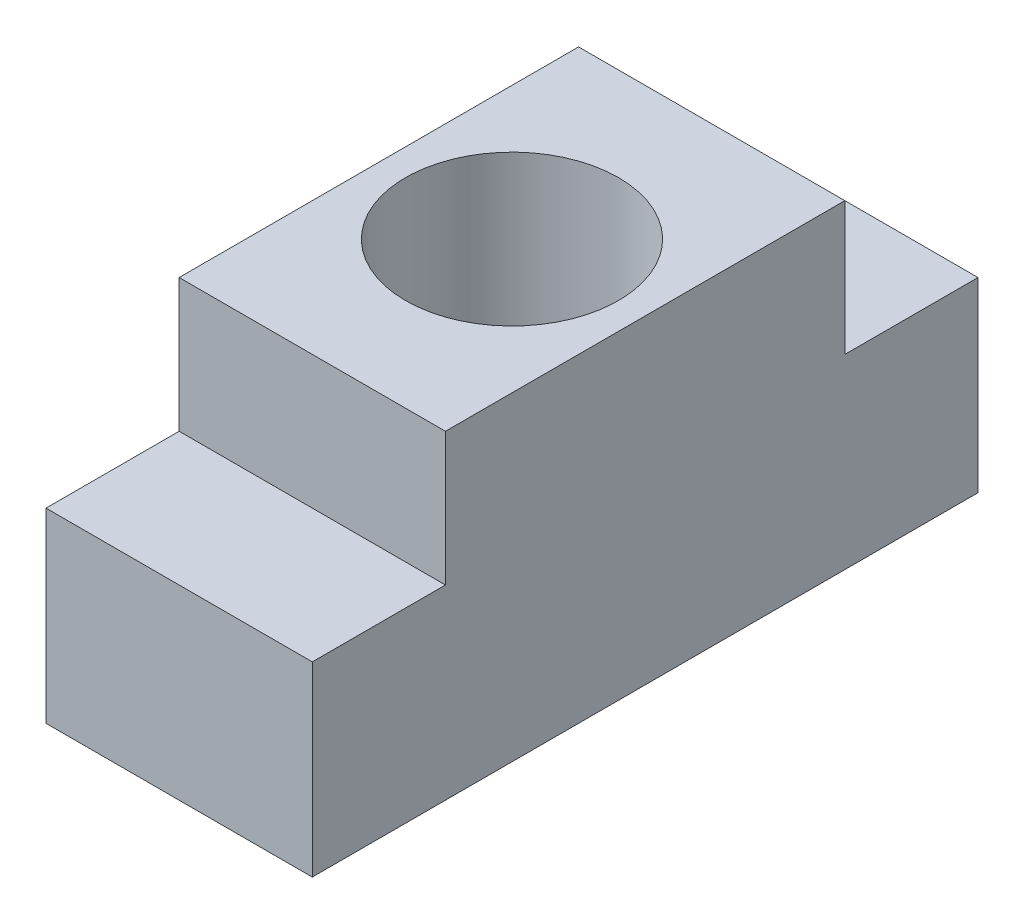
ISO-10303-21;
HEADER;
FILE_DESCRIPTION(('STEP AP214'),'2;1');
FILE_NAME('part.step','',(''),(''),'','','');
FILE_SCHEMA(('AUTOMOTIVE_DESIGN { 1 0 10303 214 1 1 1 1 }'));
ENDSEC;
DATA;
#1=APPLICATION_CONTEXT('core data for automotive mechanical design processes');
#2=APPLICATION_PROTOCOL_DEFINITION('international standard','automotive_design',2000,#1);
#3=PRODUCT_CONTEXT('',#1,'mechanical');
#4=PRODUCT('Part','Part','',(#3));
#5=PRODUCT_RELATED_PRODUCT_CATEGORY('part','',(#4));
#6=PRODUCT_DEFINITION_FORMATION('','',#4);
#7=PRODUCT_DEFINITION_CONTEXT('part definition',#1,'design');
#8=PRODUCT_DEFINITION('design','',#6,#7);
#9=PRODUCT_DEFINITION_SHAPE('','',#8);
#10=(LENGTH_UNIT() NAMED_UNIT(*) SI_UNIT(.MILLI.,.METRE.));
#11=(NAMED_UNIT(*) PLANE_ANGLE_UNIT() SI_UNIT($,.RADIAN.));
#12=(NAMED_UNIT(*) SI_UNIT($,.STERADIAN.) SOLID_ANGLE_UNIT());
#13=UNCERTAINTY_MEASURE_WITH_UNIT(LENGTH_MEASURE(1.E-05),#10,'distance_accuracy_value','');
#14=(GEOMETRIC_REPRESENTATION_CONTEXT(3) GLOBAL_UNCERTAINTY_ASSIGNED_CONTEXT((#13)) GLOBAL_UNIT_ASSIGNED_CONTEXT((#10,
#11,#12)) REPRESENTATION_CONTEXT('',''));
#15=CARTESIAN_POINT('',(0.,0.,0.));
#16=DIRECTION('',(0.,0.,1.));
#17=DIRECTION('',(1.,0.,0.));
#18=AXIS2_PLACEMENT_3D('',#15,#16,#17);
#19=CARTESIAN_POINT('',(10.,7.,0.));
#20=DIRECTION('',(0.,0.,-1.));
#21=DIRECTION('',(0.,1.,0.));
#22=AXIS2_PLACEMENT_3D('',#19,#20,#21);
#23=PLANE('',#22);
#24=DIRECTION('',(0.,-1.,0.));
#25=VECTOR('',#24,1.);
#26=CARTESIAN_POINT('',(0.,7.,0.));
#27=LINE('',#26,#25);
#28=CARTESIAN_POINT('',(0.,7.,0.));
#29=VERTEX_POINT('',#28);
#30=CARTESIAN_POINT('',(0.,0.,0.));
#31=VERTEX_POINT('',#30);
#32=EDGE_CURVE('E129',#29,#31,#27,.T.);
#33=ORIENTED_EDGE('',*,*,#32,.T.);
#34=DIRECTION('',(-1.,0.,0.));
#35=VECTOR('',#34,1.);
#36=CARTESIAN_POINT('',(10.,0.,0.));
#37=LINE('',#36,#35);
#38=CARTESIAN_POINT('',(10.,0.,0.));
#39=VERTEX_POINT('',#38);
#40=EDGE_CURVE('E11',#39,#31,#37,.T.);
#41=ORIENTED_EDGE('',*,*,#40,.F.);
#42=DIRECTION('',(0.,-1.,0.));
#43=VECTOR('',#42,1.);
#44=CARTESIAN_POINT('',(10.,7.,0.));
#45=LINE('',#44,#43);
#46=CARTESIAN_POINT('',(10.,7.,0.));
#47=VERTEX_POINT('',#46);
#48=EDGE_CURVE('E144',#47,#39,#45,.T.);
#49=ORIENTED_EDGE('',*,*,#48,.F.);
#50=DIRECTION('',(-1.,0.,0.));
#51=VECTOR('',#50,1.);
#52=CARTESIAN_POINT('',(10.,7.,0.));
#53=LINE('',#52,#51);
#54=EDGE_CURVE('E125',#47,#29,#53,.T.);
#55=ORIENTED_EDGE('',*,*,#54,.T.);
#56=EDGE_LOOP('',(#33,#41,#49,#55));
#57=FACE_BOUND('',#56,.T.);
#58=ADVANCED_FACE('F33',(#57),#23,.F.);
#59=CARTESIAN_POINT('',(10.,0.,0.));
#60=DIRECTION('',(0.,1.,0.));
#61=DIRECTION('',(0.,0.,1.));
#62=AXIS2_PLACEMENT_3D('',#59,#60,#61);
#63=PLANE('',#62);
#64=CARTESIAN_POINT('',(5.,0.,-12.5));
#65=DIRECTION('',(0.,1.,0.));
#66=DIRECTION('',(0.,0.,1.));
#67=AXIS2_PLACEMENT_3D('',#64,#65,#66);
#68=CIRCLE('',#67,4.);
#69=CARTESIAN_POINT('',(5.,0.,-8.5));
#70=VERTEX_POINT('',#69);
#71=EDGE_CURVE('E133',#70,#70,#68,.T.);
#72=ORIENTED_EDGE('',*,*,#71,.T.);
#73=EDGE_LOOP('',(#72));
#74=FACE_BOUND('',#73,.T.);
#75=DIRECTION('',(0.,0.,-1.));
#76=VECTOR('',#75,1.);
#77=CARTESIAN_POINT('',(0.,0.,0.));
#78=LINE('',#77,#76);
#79=CARTESIAN_POINT('',(0.,0.,-25.));
#80=VERTEX_POINT('',#79);
#81=EDGE_CURVE('E132',#31,#80,#78,.T.);
#82=ORIENTED_EDGE('',*,*,#81,.T.);
#83=DIRECTION('',(-1.,0.,0.));
#84=VECTOR('',#83,1.);
#85=CARTESIAN_POINT('',(10.,0.,-25.));
#86=LINE('',#85,#84);
#87=CARTESIAN_POINT('',(10.,0.,-25.));
#88=VERTEX_POINT('',#87);
#89=EDGE_CURVE('E41',#88,#80,#86,.T.);
#90=ORIENTED_EDGE('',*,*,#89,.F.);
#91=DIRECTION('',(0.,0.,-1.));
#92=VECTOR('',#91,1.);
#93=CARTESIAN_POINT('',(10.,0.,0.));
#94=LINE('',#93,#92);
#95=EDGE_CURVE('E92',#39,#88,#94,.T.);
#96=ORIENTED_EDGE('',*,*,#95,.F.);
#97=ORIENTED_EDGE('',*,*,#40,.T.);
#98=EDGE_LOOP('',(#82,#90,#96,#97));
#99=FACE_BOUND('',#98,.T.);
#100=ADVANCED_FACE('F183',(#74,#99),#63,.F.);
#101=CARTESIAN_POINT('',(10.,0.,-25.));
#102=DIRECTION('',(0.,0.,1.));
#103=DIRECTION('',(1.,0.,0.));
#104=AXIS2_PLACEMENT_3D('',#101,#102,#103);
#105=PLANE('',#104);
#106=DIRECTION('',(0.,1.,0.));
#107=VECTOR('',#106,1.);
#108=CARTESIAN_POINT('',(0.,0.,-25.));
#109=LINE('',#108,#107);
#110=CARTESIAN_POINT('',(0.,7.,-25.));
#111=VERTEX_POINT('',#110);
#112=EDGE_CURVE('E135',#80,#111,#109,.T.);
#113=ORIENTED_EDGE('',*,*,#112,.T.);
#114=DIRECTION('',(-1.,0.,0.));
#115=VECTOR('',#114,1.);
#116=CARTESIAN_POINT('',(10.,7.,-25.));
#117=LINE('',#116,#115);
#118=CARTESIAN_POINT('',(10.,7.,-25.));
#119=VERTEX_POINT('',#118);
#120=EDGE_CURVE('E151',#119,#111,#117,.T.);
#121=ORIENTED_EDGE('',*,*,#120,.F.);
#122=DIRECTION('',(0.,1.,0.));
#123=VECTOR('',#122,1.);
#124=CARTESIAN_POINT('',(10.,0.,-25.));
#125=LINE('',#124,#123);
#126=EDGE_CURVE('E159',#88,#119,#125,.T.);
#127=ORIENTED_EDGE('',*,*,#126,.F.);
#128=ORIENTED_EDGE('',*,*,#89,.T.);
#129=EDGE_LOOP('',(#113,#121,#127,#128));
#130=FACE_BOUND('',#129,.T.);
#131=ADVANCED_FACE('F157',(#130),#105,.F.);
#132=CARTESIAN_POINT('',(10.,7.,-25.));
#133=DIRECTION('',(0.,-1.,0.));
#134=DIRECTION('',(0.,0.,-1.));
#135=AXIS2_PLACEMENT_3D('',#132,#133,#134);
#136=PLANE('',#135);
#137=DIRECTION('',(0.,0.,1.));
#138=VECTOR('',#137,1.);
#139=CARTESIAN_POINT('',(0.,7.,-25.));
#140=LINE('',#139,#138);
#141=CARTESIAN_POINT('',(0.,7.,-20.));
#142=VERTEX_POINT('',#141);
#143=EDGE_CURVE('E137',#111,#142,#140,.T.);
#144=ORIENTED_EDGE('',*,*,#143,.T.);
#145=DIRECTION('',(-1.,0.,0.));
#146=VECTOR('',#145,1.);
#147=CARTESIAN_POINT('',(10.,7.,-20.));
#148=LINE('',#147,#146);
#149=CARTESIAN_POINT('',(10.,7.,-20.));
#150=VERTEX_POINT('',#149);
#151=EDGE_CURVE('E148',#150,#142,#148,.T.);
#152=ORIENTED_EDGE('',*,*,#151,.F.);
#153=DIRECTION('',(0.,0.,1.));
#154=VECTOR('',#153,1.);
#155=CARTESIAN_POINT('',(10.,7.,-25.));
#156=LINE('',#155,#154);
#157=EDGE_CURVE('E171',#119,#150,#156,.T.);
#158=ORIENTED_EDGE('',*,*,#157,.F.);
#159=ORIENTED_EDGE('',*,*,#120,.T.);
#160=EDGE_LOOP('',(#144,#152,#158,#159));
#161=FACE_BOUND('',#160,.T.);
#162=ADVANCED_FACE('F167',(#161),#136,.F.);
#163=CARTESIAN_POINT('',(10.,7.,-20.));
#164=DIRECTION('',(0.,0.,1.));
#165=DIRECTION('',(1.,0.,0.));
#166=AXIS2_PLACEMENT_3D('',#163,#164,#165);
#167=PLANE('',#166);
#168=DIRECTION('',(0.,1.,0.));
#169=VECTOR('',#168,1.);
#170=CARTESIAN_POINT('',(0.,7.,-20.));
#171=LINE('',#170,#169);
#172=CARTESIAN_POINT('',(0.,12.,-20.));
#173=VERTEX_POINT('',#172);
#174=EDGE_CURVE('E139',#142,#173,#171,.T.);
#175=ORIENTED_EDGE('',*,*,#174,.T.);
#176=DIRECTION('',(-1.,0.,0.));
#177=VECTOR('',#176,1.);
#178=CARTESIAN_POINT('',(10.,12.,-20.));
#179=LINE('',#178,#177);
#180=CARTESIAN_POINT('',(10.,12.,-20.));
#181=VERTEX_POINT('',#180);
#182=EDGE_CURVE('E120',#181,#173,#179,.T.);
#183=ORIENTED_EDGE('',*,*,#182,.F.);
#184=DIRECTION('',(0.,1.,0.));
#185=VECTOR('',#184,1.);
#186=CARTESIAN_POINT('',(10.,7.,-20.));
#187=LINE('',#186,#185);
#188=EDGE_CURVE('E111',#150,#181,#187,.T.);
#189=ORIENTED_EDGE('',*,*,#188,.F.);
#190=ORIENTED_EDGE('',*,*,#151,.T.);
#191=EDGE_LOOP('',(#175,#183,#189,#190));
#192=FACE_BOUND('',#191,.T.);
#193=ADVANCED_FACE('F170',(#192),#167,.F.);
#194=CARTESIAN_POINT('',(10.,12.,-20.));
#195=DIRECTION('',(0.,-1.,0.));
#196=DIRECTION('',(0.,0.,-1.));
#197=AXIS2_PLACEMENT_3D('',#194,#195,#196);
#198=PLANE('',#197);
#199=CARTESIAN_POINT('',(5.,12.,-12.5));
#200=DIRECTION('',(0.,1.,0.));
#201=DIRECTION('',(0.,0.,1.));
#202=AXIS2_PLACEMENT_3D('',#199,#200,#201);
#203=CIRCLE('',#202,4.);
#204=CARTESIAN_POINT('',(5.,12.,-8.5));
#205=VERTEX_POINT('',#204);
#206=EDGE_CURVE('E177',#205,#205,#203,.T.);
#207=ORIENTED_EDGE('',*,*,#206,.F.);
#208=EDGE_LOOP('',(#207));
#209=FACE_BOUND('',#208,.T.);
#210=DIRECTION('',(0.,0.,1.));
#211=VECTOR('',#210,1.);
#212=CARTESIAN_POINT('',(0.,12.,-20.));
#213=LINE('',#212,#211);
#214=CARTESIAN_POINT('',(0.,12.,-5.));
#215=VERTEX_POINT('',#214);
#216=EDGE_CURVE('E119',#173,#215,#213,.T.);
#217=ORIENTED_EDGE('',*,*,#216,.T.);
#218=DIRECTION('',(-1.,0.,0.));
#219=VECTOR('',#218,1.);
#220=CARTESIAN_POINT('',(10.,12.,-5.));
#221=LINE('',#220,#219);
#222=CARTESIAN_POINT('',(10.,12.,-5.));
#223=VERTEX_POINT('',#222);
#224=EDGE_CURVE('E116',#223,#215,#221,.T.);
#225=ORIENTED_EDGE('',*,*,#224,.F.);
#226=DIRECTION('',(0.,0.,1.));
#227=VECTOR('',#226,1.);
#228=CARTESIAN_POINT('',(10.,12.,-20.));
#229=LINE('',#228,#227);
#230=EDGE_CURVE('E105',#181,#223,#229,.T.);
#231=ORIENTED_EDGE('',*,*,#230,.F.);
#232=ORIENTED_EDGE('',*,*,#182,.T.);
#233=EDGE_LOOP('',(#217,#225,#231,#232));
#234=FACE_BOUND('',#233,.T.);
#235=ADVANCED_FACE('F117',(#209,#234),#198,.F.);
#236=CARTESIAN_POINT('',(10.,12.,-5.));
#237=DIRECTION('',(0.,0.,-1.));
#238=DIRECTION('',(-1.,0.,0.));
#239=AXIS2_PLACEMENT_3D('',#236,#237,#238);
#240=PLANE('',#239);
#241=DIRECTION('',(0.,-1.,0.));
#242=VECTOR('',#241,1.);
#243=CARTESIAN_POINT('',(0.,12.,-5.));
#244=LINE('',#243,#242);
#245=CARTESIAN_POINT('',(0.,7.,-5.));
#246=VERTEX_POINT('',#245);
#247=EDGE_CURVE('E78',#215,#246,#244,.T.);
#248=ORIENTED_EDGE('',*,*,#247,.T.);
#249=DIRECTION('',(-1.,0.,0.));
#250=VECTOR('',#249,1.);
#251=CARTESIAN_POINT('',(10.,7.,-5.));
#252=LINE('',#251,#250);
#253=CARTESIAN_POINT('',(10.,7.,-5.));
#254=VERTEX_POINT('',#253);
#255=EDGE_CURVE('E121',#254,#246,#252,.T.);
#256=ORIENTED_EDGE('',*,*,#255,.F.);
#257=DIRECTION('',(0.,-1.,0.));
#258=VECTOR('',#257,1.);
#259=CARTESIAN_POINT('',(10.,12.,-5.));
#260=LINE('',#259,#258);
#261=EDGE_CURVE('E109',#223,#254,#260,.T.);
#262=ORIENTED_EDGE('',*,*,#261,.F.);
#263=ORIENTED_EDGE('',*,*,#224,.T.);
#264=EDGE_LOOP('',(#248,#256,#262,#263));
#265=FACE_BOUND('',#264,.T.);
#266=ADVANCED_FACE('F123',(#265),#240,.F.);
#267=CARTESIAN_POINT('',(10.,7.,-5.));
#268=DIRECTION('',(0.,-1.,0.));
#269=DIRECTION('',(0.,0.,-1.));
#270=AXIS2_PLACEMENT_3D('',#267,#268,#269);
#271=PLANE('',#270);
#272=DIRECTION('',(0.,0.,1.));
#273=VECTOR('',#272,1.);
#274=CARTESIAN_POINT('',(0.,7.,-5.));
#275=LINE('',#274,#273);
#276=EDGE_CURVE('E84',#246,#29,#275,.T.);
#277=ORIENTED_EDGE('',*,*,#276,.T.);
#278=ORIENTED_EDGE('',*,*,#54,.F.);
#279=DIRECTION('',(0.,0.,1.));
#280=VECTOR('',#279,1.);
#281=CARTESIAN_POINT('',(10.,7.,-5.));
#282=LINE('',#281,#280);
#283=EDGE_CURVE('E49',#254,#47,#282,.T.);
#284=ORIENTED_EDGE('',*,*,#283,.F.);
#285=ORIENTED_EDGE('',*,*,#255,.T.);
#286=EDGE_LOOP('',(#277,#278,#284,#285));
#287=FACE_BOUND('',#286,.T.);
#288=ADVANCED_FACE('F197',(#287),#271,.F.);
#289=CARTESIAN_POINT('',(10.,0.,0.));
#290=DIRECTION('',(1.,0.,0.));
#291=DIRECTION('',(0.,0.,-1.));
#292=AXIS2_PLACEMENT_3D('',#289,#290,#291);
#293=PLANE('',#292);
#294=ORIENTED_EDGE('',*,*,#48,.T.);
#295=ORIENTED_EDGE('',*,*,#95,.T.);
#296=ORIENTED_EDGE('',*,*,#126,.T.);
#297=ORIENTED_EDGE('',*,*,#157,.T.);
#298=ORIENTED_EDGE('',*,*,#188,.T.);
#299=ORIENTED_EDGE('',*,*,#230,.T.);
#300=ORIENTED_EDGE('',*,*,#261,.T.);
#301=ORIENTED_EDGE('',*,*,#283,.T.);
#302=EDGE_LOOP('',(#294,#295,#296,#297,#298,#299,#300,#301));
#303=FACE_BOUND('',#302,.T.);
#304=ADVANCED_FACE('F107',(#303),#293,.T.);
#305=CARTESIAN_POINT('',(0.,0.,0.));
#306=DIRECTION('',(1.,0.,0.));
#307=DIRECTION('',(0.,0.,-1.));
#308=AXIS2_PLACEMENT_3D('',#305,#306,#307);
#309=PLANE('',#308);
#310=ORIENTED_EDGE('',*,*,#32,.F.);
#311=ORIENTED_EDGE('',*,*,#276,.F.);
#312=ORIENTED_EDGE('',*,*,#247,.F.);
#313=ORIENTED_EDGE('',*,*,#216,.F.);
#314=ORIENTED_EDGE('',*,*,#174,.F.);
#315=ORIENTED_EDGE('',*,*,#143,.F.);
#316=ORIENTED_EDGE('',*,*,#112,.F.);
#317=ORIENTED_EDGE('',*,*,#81,.F.);
#318=EDGE_LOOP('',(#310,#311,#312,#313,#314,#315,#316,#317));
#319=FACE_BOUND('',#318,.T.);
#320=ADVANCED_FACE('F163',(#319),#309,.F.);
#321=CARTESIAN_POINT('',(5.,0.,-12.5));
#322=DIRECTION('',(0.,1.,0.));
#323=DIRECTION('',(0.,0.,1.));
#324=AXIS2_PLACEMENT_3D('',#321,#322,#323);
#325=CYLINDRICAL_SURFACE('',#324,4.);
#326=ORIENTED_EDGE('',*,*,#71,.F.);
#327=EDGE_LOOP('',(#326));
#328=FACE_BOUND('',#327,.T.);
#329=ORIENTED_EDGE('',*,*,#206,.T.);
#330=EDGE_LOOP('',(#329));
#331=FACE_BOUND('',#330,.T.);
#332=ADVANCED_FACE('F185',(#328,#331),#325,.F.);
#333=CLOSED_SHELL('',(#58,#100,#131,#162,#193,#235,#266,#288,#304,#320,#332));
#334=MANIFOLD_SOLID_BREP('B2',#333);
#335=ADVANCED_BREP_SHAPE_REPRESENTATION('',(#18,#334),#14);
#336=SHAPE_DEFINITION_REPRESENTATION(#9,#335);
ENDSEC;
END-ISO-10303-21;
